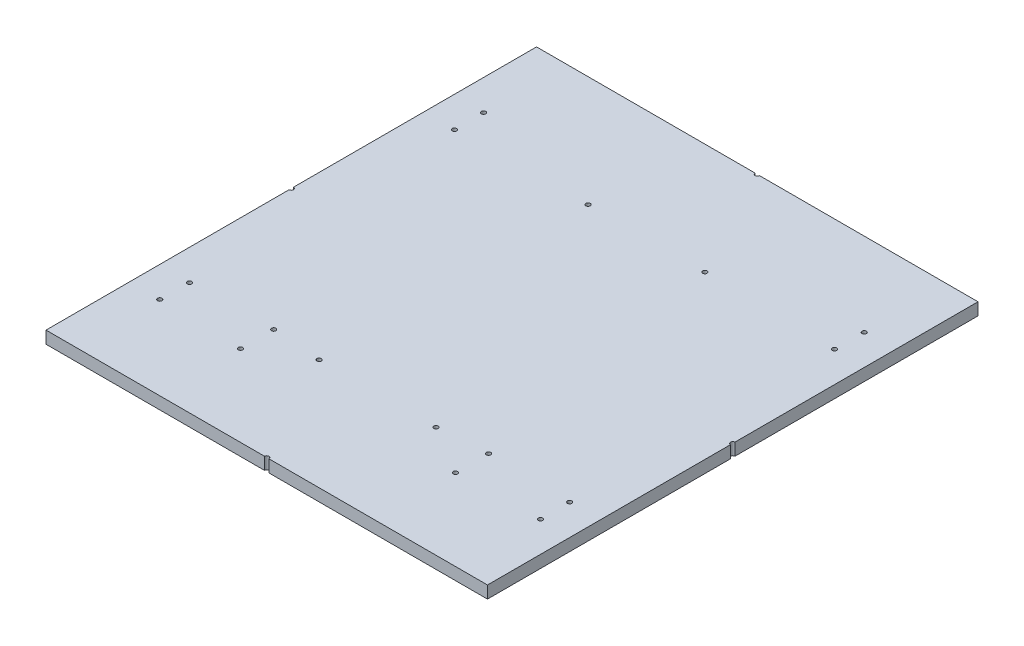
ISO-10303-21;
HEADER;
FILE_DESCRIPTION(('STEP AP214'),'2;1');
FILE_NAME('part.step','',(''),(''),'','','');
FILE_SCHEMA(('AUTOMOTIVE_DESIGN { 1 0 10303 214 1 1 1 1 }'));
ENDSEC;
DATA;
#1=APPLICATION_CONTEXT('core data for automotive mechanical design processes');
#2=APPLICATION_PROTOCOL_DEFINITION('international standard','automotive_design',2000,#1);
#3=PRODUCT_CONTEXT('',#1,'mechanical');
#4=PRODUCT('Part','Part','',(#3));
#5=PRODUCT_RELATED_PRODUCT_CATEGORY('part','',(#4));
#6=PRODUCT_DEFINITION_FORMATION('','',#4);
#7=PRODUCT_DEFINITION_CONTEXT('part definition',#1,'design');
#8=PRODUCT_DEFINITION('design','',#6,#7);
#9=PRODUCT_DEFINITION_SHAPE('','',#8);
#10=(LENGTH_UNIT() NAMED_UNIT(*) SI_UNIT(.MILLI.,.METRE.));
#11=(NAMED_UNIT(*) PLANE_ANGLE_UNIT() SI_UNIT($,.RADIAN.));
#12=(NAMED_UNIT(*) SI_UNIT($,.STERADIAN.) SOLID_ANGLE_UNIT());
#13=UNCERTAINTY_MEASURE_WITH_UNIT(LENGTH_MEASURE(1.E-05),#10,'distance_accuracy_value','');
#14=(GEOMETRIC_REPRESENTATION_CONTEXT(3) GLOBAL_UNCERTAINTY_ASSIGNED_CONTEXT((#13)) GLOBAL_UNIT_ASSIGNED_CONTEXT((#10,
#11,#12)) REPRESENTATION_CONTEXT('',''));
#15=CARTESIAN_POINT('',(0.,0.,0.));
#16=DIRECTION('',(0.,0.,1.));
#17=DIRECTION('',(1.,0.,0.));
#18=AXIS2_PLACEMENT_3D('',#15,#16,#17);
#19=CARTESIAN_POINT('',(0.,6.35,0.));
#20=DIRECTION('',(1.,0.,0.));
#21=DIRECTION('',(0.,0.,-1.));
#22=AXIS2_PLACEMENT_3D('',#19,#20,#21);
#23=PLANE('',#22);
#24=DIRECTION('',(0.,0.,1.));
#25=VECTOR('',#24,1.);
#26=CARTESIAN_POINT('',(0.,0.,0.));
#27=LINE('',#26,#25);
#28=CARTESIAN_POINT('',(0.,0.,-254.));
#29=VERTEX_POINT('',#28);
#30=CARTESIAN_POINT('',(0.,0.,-128.1303));
#31=VERTEX_POINT('',#30);
#32=EDGE_CURVE('E165',#29,#31,#27,.T.);
#33=ORIENTED_EDGE('',*,*,#32,.T.);
#34=DIRECTION('',(0.,1.,0.));
#35=VECTOR('',#34,1.);
#36=CARTESIAN_POINT('',(0.,6.35,-128.1303));
#37=LINE('',#36,#35);
#38=CARTESIAN_POINT('',(0.,6.35,-128.1303));
#39=VERTEX_POINT('',#38);
#40=EDGE_CURVE('E141',#31,#39,#37,.T.);
#41=ORIENTED_EDGE('',*,*,#40,.T.);
#42=DIRECTION('',(0.,0.,1.));
#43=VECTOR('',#42,1.);
#44=CARTESIAN_POINT('',(0.,6.35,0.));
#45=LINE('',#44,#43);
#46=CARTESIAN_POINT('',(0.,6.35,-254.));
#47=VERTEX_POINT('',#46);
#48=EDGE_CURVE('E220',#47,#39,#45,.T.);
#49=ORIENTED_EDGE('',*,*,#48,.F.);
#50=DIRECTION('',(0.,-1.,0.));
#51=VECTOR('',#50,1.);
#52=CARTESIAN_POINT('',(0.,6.35,-254.));
#53=LINE('',#52,#51);
#54=EDGE_CURVE('E185',#47,#29,#53,.T.);
#55=ORIENTED_EDGE('',*,*,#54,.T.);
#56=EDGE_LOOP('',(#33,#41,#49,#55));
#57=FACE_BOUND('',#56,.T.);
#58=ADVANCED_FACE('F52',(#57),#23,.F.);
#59=CARTESIAN_POINT('',(0.,0.,0.));
#60=DIRECTION('',(0.,-1.,0.));
#61=DIRECTION('',(0.,0.,-1.));
#62=AXIS2_PLACEMENT_3D('',#59,#60,#61);
#63=PLANE('',#62);
#64=CARTESIAN_POINT('',(58.6588414103042,0.,-59.1894930297));
#65=DIRECTION('',(0.,1.,0.));
#66=DIRECTION('',(0.,0.,1.));
#67=AXIS2_PLACEMENT_3D('',#64,#65,#66);
#68=CIRCLE('',#67,1.1303);
#69=CARTESIAN_POINT('',(58.6588414103042,0.,-58.0591930297));
#70=VERTEX_POINT('',#69);
#71=EDGE_CURVE('E728',#70,#70,#68,.T.);
#72=ORIENTED_EDGE('',*,*,#71,.T.);
#73=EDGE_LOOP('',(#72));
#74=FACE_BOUND('',#73,.T.);
#75=CARTESIAN_POINT('',(58.6588414103042,0.,-42.0497));
#76=DIRECTION('',(0.,1.,0.));
#77=DIRECTION('',(0.,0.,1.));
#78=AXIS2_PLACEMENT_3D('',#75,#76,#77);
#79=CIRCLE('',#78,1.1303);
#80=CARTESIAN_POINT('',(58.6588414103042,0.,-40.9194));
#81=VERTEX_POINT('',#80);
#82=EDGE_CURVE('E739',#81,#81,#79,.T.);
#83=ORIENTED_EDGE('',*,*,#82,.T.);
#84=EDGE_LOOP('',(#83));
#85=FACE_BOUND('',#84,.T.);
#86=CARTESIAN_POINT('',(169.961688198213,0.,-59.1894930297));
#87=DIRECTION('',(0.,1.,0.));
#88=DIRECTION('',(0.,0.,1.));
#89=AXIS2_PLACEMENT_3D('',#86,#87,#88);
#90=CIRCLE('',#89,1.1303);
#91=CARTESIAN_POINT('',(169.961688198213,0.,-58.0591930297));
#92=VERTEX_POINT('',#91);
#93=EDGE_CURVE('E742',#92,#92,#90,.T.);
#94=ORIENTED_EDGE('',*,*,#93,.T.);
#95=EDGE_LOOP('',(#94));
#96=FACE_BOUND('',#95,.T.);
#97=CARTESIAN_POINT('',(169.961688198213,0.,-42.0497));
#98=DIRECTION('',(0.,1.,0.));
#99=DIRECTION('',(0.,0.,1.));
#100=AXIS2_PLACEMENT_3D('',#97,#98,#99);
#101=CIRCLE('',#100,1.1303);
#102=CARTESIAN_POINT('',(169.961688198213,0.,-40.9194));
#103=VERTEX_POINT('',#102);
#104=EDGE_CURVE('E749',#103,#103,#101,.T.);
#105=ORIENTED_EDGE('',*,*,#104,.T.);
#106=EDGE_LOOP('',(#105));
#107=FACE_BOUND('',#106,.T.);
#108=CARTESIAN_POINT('',(15.7351594072584,0.,-43.18));
#109=DIRECTION('',(0.,1.,0.));
#110=DIRECTION('',(0.,0.,1.));
#111=AXIS2_PLACEMENT_3D('',#108,#109,#110);
#112=CIRCLE('',#111,1.1303);
#113=CARTESIAN_POINT('',(15.7351594072584,0.,-42.0497));
#114=VERTEX_POINT('',#113);
#115=EDGE_CURVE('E756',#114,#114,#112,.T.);
#116=ORIENTED_EDGE('',*,*,#115,.T.);
#117=EDGE_LOOP('',(#116));
#118=FACE_BOUND('',#117,.T.);
#119=CARTESIAN_POINT('',(15.8749999999998,0.,-58.42));
#120=DIRECTION('',(0.,1.,0.));
#121=DIRECTION('',(0.,0.,1.));
#122=AXIS2_PLACEMENT_3D('',#119,#120,#121);
#123=CIRCLE('',#122,1.1303);
#124=CARTESIAN_POINT('',(15.8749999999998,0.,-57.2897));
#125=VERTEX_POINT('',#124);
#126=EDGE_CURVE('E765',#125,#125,#123,.T.);
#127=ORIENTED_EDGE('',*,*,#126,.T.);
#128=EDGE_LOOP('',(#127));
#129=FACE_BOUND('',#128,.T.);
#130=CARTESIAN_POINT('',(84.0588414103042,0.,-57.3884371810008));
#131=DIRECTION('',(0.,1.,0.));
#132=DIRECTION('',(0.,0.,1.));
#133=AXIS2_PLACEMENT_3D('',#130,#131,#132);
#134=CIRCLE('',#133,1.1303);
#135=CARTESIAN_POINT('',(84.0588414103042,0.,-56.2581371810008));
#136=VERTEX_POINT('',#135);
#137=EDGE_CURVE('E767',#136,#136,#134,.T.);
#138=ORIENTED_EDGE('',*,*,#137,.T.);
#139=EDGE_LOOP('',(#138));
#140=FACE_BOUND('',#139,.T.);
#141=CARTESIAN_POINT('',(144.561688198213,0.,-57.3884371810008));
#142=DIRECTION('',(0.,1.,0.));
#143=DIRECTION('',(0.,0.,1.));
#144=AXIS2_PLACEMENT_3D('',#141,#142,#143);
#145=CIRCLE('',#144,1.1303);
#146=CARTESIAN_POINT('',(144.561688198213,0.,-56.2581371810008));
#147=VERTEX_POINT('',#146);
#148=EDGE_CURVE('E252',#147,#147,#145,.T.);
#149=ORIENTED_EDGE('',*,*,#148,.T.);
#150=EDGE_LOOP('',(#149));
#151=FACE_BOUND('',#150,.T.);
#152=CARTESIAN_POINT('',(0.,0.,-127.));
#153=DIRECTION('',(0.,1.,0.));
#154=DIRECTION('',(0.,0.,1.));
#155=AXIS2_PLACEMENT_3D('',#152,#153,#154);
#156=CIRCLE('',#155,1.1303);
#157=CARTESIAN_POINT('',(0.,0.,-125.8697));
#158=VERTEX_POINT('',#157);
#159=EDGE_CURVE('E139',#158,#31,#156,.T.);
#160=ORIENTED_EDGE('',*,*,#159,.T.);
#161=ORIENTED_EDGE('',*,*,#32,.F.);
#162=DIRECTION('',(-1.,0.,0.));
#163=VECTOR('',#162,1.);
#164=CARTESIAN_POINT('',(0.,0.,-254.));
#165=LINE('',#164,#163);
#166=CARTESIAN_POINT('',(113.1697,0.,-254.));
#167=VERTEX_POINT('',#166);
#168=EDGE_CURVE('E178',#167,#29,#165,.T.);
#169=ORIENTED_EDGE('',*,*,#168,.F.);
#170=CARTESIAN_POINT('',(114.3,0.,-254.));
#171=DIRECTION('',(0.,-1.,0.));
#172=DIRECTION('',(0.,0.,-1.));
#173=AXIS2_PLACEMENT_3D('',#170,#171,#172);
#174=CIRCLE('',#173,1.13029999999999);
#175=CARTESIAN_POINT('',(115.4303,0.,-254.));
#176=VERTEX_POINT('',#175);
#177=EDGE_CURVE('E193',#176,#167,#174,.T.);
#178=ORIENTED_EDGE('',*,*,#177,.F.);
#179=CARTESIAN_POINT('',(228.6,0.,-254.));
#180=VERTEX_POINT('',#179);
#181=EDGE_CURVE('E177',#180,#176,#165,.T.);
#182=ORIENTED_EDGE('',*,*,#181,.F.);
#183=DIRECTION('',(0.,0.,-1.));
#184=VECTOR('',#183,1.);
#185=CARTESIAN_POINT('',(228.6,0.,0.));
#186=LINE('',#185,#184);
#187=CARTESIAN_POINT('',(228.6,0.,-128.1303));
#188=VERTEX_POINT('',#187);
#189=EDGE_CURVE('E173',#188,#180,#186,.T.);
#190=ORIENTED_EDGE('',*,*,#189,.F.);
#191=CARTESIAN_POINT('',(228.6,0.,-127.));
#192=DIRECTION('',(0.,1.,0.));
#193=DIRECTION('',(0.,0.,1.));
#194=AXIS2_PLACEMENT_3D('',#191,#192,#193);
#195=CIRCLE('',#194,1.1303);
#196=CARTESIAN_POINT('',(228.6,0.,-125.8697));
#197=VERTEX_POINT('',#196);
#198=EDGE_CURVE('E194',#188,#197,#195,.T.);
#199=ORIENTED_EDGE('',*,*,#198,.T.);
#200=CARTESIAN_POINT('',(228.6,0.,0.));
#201=VERTEX_POINT('',#200);
#202=EDGE_CURVE('E175',#201,#197,#186,.T.);
#203=ORIENTED_EDGE('',*,*,#202,.F.);
#204=DIRECTION('',(1.,0.,0.));
#205=VECTOR('',#204,1.);
#206=CARTESIAN_POINT('',(0.,0.,0.));
#207=LINE('',#206,#205);
#208=CARTESIAN_POINT('',(115.4303,0.,0.));
#209=VERTEX_POINT('',#208);
#210=EDGE_CURVE('E164',#209,#201,#207,.T.);
#211=ORIENTED_EDGE('',*,*,#210,.F.);
#212=CARTESIAN_POINT('',(114.3,0.,0.));
#213=DIRECTION('',(0.,1.,0.));
#214=DIRECTION('',(0.,0.,1.));
#215=AXIS2_PLACEMENT_3D('',#212,#213,#214);
#216=CIRCLE('',#215,1.1303);
#217=CARTESIAN_POINT('',(113.1697,0.,0.));
#218=VERTEX_POINT('',#217);
#219=EDGE_CURVE('E76',#209,#218,#216,.T.);
#220=ORIENTED_EDGE('',*,*,#219,.T.);
#221=CARTESIAN_POINT('',(0.,0.,0.));
#222=VERTEX_POINT('',#221);
#223=EDGE_CURVE('E159',#222,#218,#207,.T.);
#224=ORIENTED_EDGE('',*,*,#223,.F.);
#225=EDGE_CURVE('E153',#158,#222,#27,.T.);
#226=ORIENTED_EDGE('',*,*,#225,.F.);
#227=EDGE_LOOP('',(#160,#161,#169,#178,#182,#190,#199,#203,#211,#220,#224,#226));
#228=FACE_BOUND('',#227,.T.);
#229=CARTESIAN_POINT('',(144.561688198213,0.,-196.611562818999));
#230=DIRECTION('',(0.,1.,0.));
#231=DIRECTION('',(0.,0.,1.));
#232=AXIS2_PLACEMENT_3D('',#229,#230,#231);
#233=CIRCLE('',#232,1.1303);
#234=CARTESIAN_POINT('',(144.561688198213,0.,-195.481262818999));
#235=VERTEX_POINT('',#234);
#236=EDGE_CURVE('E263',#235,#235,#233,.T.);
#237=ORIENTED_EDGE('',*,*,#236,.T.);
#238=EDGE_LOOP('',(#237));
#239=FACE_BOUND('',#238,.T.);
#240=CARTESIAN_POINT('',(84.0588414103042,0.,-196.611562818999));
#241=DIRECTION('',(0.,1.,0.));
#242=DIRECTION('',(0.,0.,1.));
#243=AXIS2_PLACEMENT_3D('',#240,#241,#242);
#244=CIRCLE('',#243,1.1303);
#245=CARTESIAN_POINT('',(84.0588414103042,0.,-195.481262818999));
#246=VERTEX_POINT('',#245);
#247=EDGE_CURVE('E267',#246,#246,#244,.T.);
#248=ORIENTED_EDGE('',*,*,#247,.T.);
#249=EDGE_LOOP('',(#248));
#250=FACE_BOUND('',#249,.T.);
#251=CARTESIAN_POINT('',(15.8749999999998,0.,-195.58));
#252=DIRECTION('',(0.,1.,0.));
#253=DIRECTION('',(0.,0.,1.));
#254=AXIS2_PLACEMENT_3D('',#251,#252,#253);
#255=CIRCLE('',#254,1.1303);
#256=CARTESIAN_POINT('',(15.8749999999998,0.,-194.4497));
#257=VERTEX_POINT('',#256);
#258=EDGE_CURVE('E274',#257,#257,#255,.T.);
#259=ORIENTED_EDGE('',*,*,#258,.T.);
#260=EDGE_LOOP('',(#259));
#261=FACE_BOUND('',#260,.T.);
#262=CARTESIAN_POINT('',(15.7351594072584,0.,-210.82));
#263=DIRECTION('',(0.,1.,0.));
#264=DIRECTION('',(0.,0.,1.));
#265=AXIS2_PLACEMENT_3D('',#262,#263,#264);
#266=CIRCLE('',#265,1.1303);
#267=CARTESIAN_POINT('',(15.7351594072584,0.,-209.6897));
#268=VERTEX_POINT('',#267);
#269=EDGE_CURVE('E281',#268,#268,#266,.T.);
#270=ORIENTED_EDGE('',*,*,#269,.T.);
#271=EDGE_LOOP('',(#270));
#272=FACE_BOUND('',#271,.T.);
#273=CARTESIAN_POINT('',(212.864840592742,0.,-43.18));
#274=DIRECTION('',(0.,1.,0.));
#275=DIRECTION('',(0.,0.,1.));
#276=AXIS2_PLACEMENT_3D('',#273,#274,#275);
#277=CIRCLE('',#276,1.1303);
#278=CARTESIAN_POINT('',(212.864840592742,0.,-42.0497));
#279=VERTEX_POINT('',#278);
#280=EDGE_CURVE('E289',#279,#279,#277,.T.);
#281=ORIENTED_EDGE('',*,*,#280,.T.);
#282=EDGE_LOOP('',(#281));
#283=FACE_BOUND('',#282,.T.);
#284=CARTESIAN_POINT('',(212.725,0.,-58.42));
#285=DIRECTION('',(0.,1.,0.));
#286=DIRECTION('',(0.,0.,1.));
#287=AXIS2_PLACEMENT_3D('',#284,#285,#286);
#288=CIRCLE('',#287,1.1303);
#289=CARTESIAN_POINT('',(212.725,0.,-57.2897));
#290=VERTEX_POINT('',#289);
#291=EDGE_CURVE('E296',#290,#290,#288,.T.);
#292=ORIENTED_EDGE('',*,*,#291,.T.);
#293=EDGE_LOOP('',(#292));
#294=FACE_BOUND('',#293,.T.);
#295=CARTESIAN_POINT('',(212.864840592742,0.,-210.82));
#296=DIRECTION('',(0.,1.,0.));
#297=DIRECTION('',(0.,0.,1.));
#298=AXIS2_PLACEMENT_3D('',#295,#296,#297);
#299=CIRCLE('',#298,1.1303);
#300=CARTESIAN_POINT('',(212.864840592742,0.,-209.6897));
#301=VERTEX_POINT('',#300);
#302=EDGE_CURVE('E305',#301,#301,#299,.T.);
#303=ORIENTED_EDGE('',*,*,#302,.T.);
#304=EDGE_LOOP('',(#303));
#305=FACE_BOUND('',#304,.T.);
#306=CARTESIAN_POINT('',(212.725,0.,-195.58));
#307=DIRECTION('',(0.,1.,0.));
#308=DIRECTION('',(0.,0.,1.));
#309=AXIS2_PLACEMENT_3D('',#306,#307,#308);
#310=CIRCLE('',#309,1.1303);
#311=CARTESIAN_POINT('',(212.725,0.,-194.4497));
#312=VERTEX_POINT('',#311);
#313=EDGE_CURVE('E209',#312,#312,#310,.T.);
#314=ORIENTED_EDGE('',*,*,#313,.T.);
#315=EDGE_LOOP('',(#314));
#316=FACE_BOUND('',#315,.T.);
#317=ADVANCED_FACE('F160',(#74,#85,#96,#107,#118,#129,#140,#151,#228,#239,#250,#261,#272,#283,
#294,#305,#316),#63,.T.);
#318=CARTESIAN_POINT('',(0.,6.35,0.));
#319=DIRECTION('',(0.,-1.,0.));
#320=DIRECTION('',(0.,0.,-1.));
#321=AXIS2_PLACEMENT_3D('',#318,#319,#320);
#322=PLANE('',#321);
#323=CARTESIAN_POINT('',(58.6588414103042,6.35,-59.1894930297));
#324=DIRECTION('',(0.,1.,0.));
#325=DIRECTION('',(0.,0.,1.));
#326=AXIS2_PLACEMENT_3D('',#323,#324,#325);
#327=CIRCLE('',#326,1.1303);
#328=CARTESIAN_POINT('',(58.6588414103042,6.35,-58.0591930297));
#329=VERTEX_POINT('',#328);
#330=EDGE_CURVE('E732',#329,#329,#327,.T.);
#331=ORIENTED_EDGE('',*,*,#330,.F.);
#332=EDGE_LOOP('',(#331));
#333=FACE_BOUND('',#332,.T.);
#334=CARTESIAN_POINT('',(58.6588414103042,6.35,-42.0497));
#335=DIRECTION('',(0.,1.,0.));
#336=DIRECTION('',(0.,0.,1.));
#337=AXIS2_PLACEMENT_3D('',#334,#335,#336);
#338=CIRCLE('',#337,1.1303);
#339=CARTESIAN_POINT('',(58.6588414103042,6.35,-40.9194));
#340=VERTEX_POINT('',#339);
#341=EDGE_CURVE('E731',#340,#340,#338,.T.);
#342=ORIENTED_EDGE('',*,*,#341,.F.);
#343=EDGE_LOOP('',(#342));
#344=FACE_BOUND('',#343,.T.);
#345=CARTESIAN_POINT('',(169.961688198213,6.35,-59.1894930297));
#346=DIRECTION('',(0.,1.,0.));
#347=DIRECTION('',(0.,0.,1.));
#348=AXIS2_PLACEMENT_3D('',#345,#346,#347);
#349=CIRCLE('',#348,1.1303);
#350=CARTESIAN_POINT('',(169.961688198213,6.35,-58.0591930297));
#351=VERTEX_POINT('',#350);
#352=EDGE_CURVE('E741',#351,#351,#349,.T.);
#353=ORIENTED_EDGE('',*,*,#352,.F.);
#354=EDGE_LOOP('',(#353));
#355=FACE_BOUND('',#354,.T.);
#356=CARTESIAN_POINT('',(169.961688198213,6.35,-42.0497));
#357=DIRECTION('',(0.,1.,0.));
#358=DIRECTION('',(0.,0.,1.));
#359=AXIS2_PLACEMENT_3D('',#356,#357,#358);
#360=CIRCLE('',#359,1.1303);
#361=CARTESIAN_POINT('',(169.961688198213,6.35,-40.9194));
#362=VERTEX_POINT('',#361);
#363=EDGE_CURVE('E747',#362,#362,#360,.T.);
#364=ORIENTED_EDGE('',*,*,#363,.F.);
#365=EDGE_LOOP('',(#364));
#366=FACE_BOUND('',#365,.T.);
#367=CARTESIAN_POINT('',(15.7351594072584,6.35,-43.18));
#368=DIRECTION('',(0.,1.,0.));
#369=DIRECTION('',(0.,0.,1.));
#370=AXIS2_PLACEMENT_3D('',#367,#368,#369);
#371=CIRCLE('',#370,1.13029999999999);
#372=CARTESIAN_POINT('',(15.7351594072584,6.35,-42.0497));
#373=VERTEX_POINT('',#372);
#374=EDGE_CURVE('E751',#373,#373,#371,.T.);
#375=ORIENTED_EDGE('',*,*,#374,.F.);
#376=EDGE_LOOP('',(#375));
#377=FACE_BOUND('',#376,.T.);
#378=CARTESIAN_POINT('',(15.8749999999998,6.35,-58.42));
#379=DIRECTION('',(0.,1.,0.));
#380=DIRECTION('',(0.,0.,1.));
#381=AXIS2_PLACEMENT_3D('',#378,#379,#380);
#382=CIRCLE('',#381,1.13029999999999);
#383=CARTESIAN_POINT('',(15.8749999999998,6.35,-57.2897));
#384=VERTEX_POINT('',#383);
#385=EDGE_CURVE('E757',#384,#384,#382,.T.);
#386=ORIENTED_EDGE('',*,*,#385,.F.);
#387=EDGE_LOOP('',(#386));
#388=FACE_BOUND('',#387,.T.);
#389=CARTESIAN_POINT('',(84.0588414103042,6.35,-57.3884371810008));
#390=DIRECTION('',(0.,1.,0.));
#391=DIRECTION('',(0.,0.,1.));
#392=AXIS2_PLACEMENT_3D('',#389,#390,#391);
#393=CIRCLE('',#392,1.13029999999999);
#394=CARTESIAN_POINT('',(84.0588414103042,6.35,-56.2581371810008));
#395=VERTEX_POINT('',#394);
#396=EDGE_CURVE('E764',#395,#395,#393,.T.);
#397=ORIENTED_EDGE('',*,*,#396,.F.);
#398=EDGE_LOOP('',(#397));
#399=FACE_BOUND('',#398,.T.);
#400=CARTESIAN_POINT('',(144.561688198213,6.35,-57.3884371810008));
#401=DIRECTION('',(0.,1.,0.));
#402=DIRECTION('',(0.,0.,1.));
#403=AXIS2_PLACEMENT_3D('',#400,#401,#402);
#404=CIRCLE('',#403,1.1303);
#405=CARTESIAN_POINT('',(144.561688198213,6.35,-56.2581371810008));
#406=VERTEX_POINT('',#405);
#407=EDGE_CURVE('E254',#406,#406,#404,.T.);
#408=ORIENTED_EDGE('',*,*,#407,.F.);
#409=EDGE_LOOP('',(#408));
#410=FACE_BOUND('',#409,.T.);
#411=CARTESIAN_POINT('',(144.561688198213,6.35,-196.611562818999));
#412=DIRECTION('',(0.,1.,0.));
#413=DIRECTION('',(0.,0.,1.));
#414=AXIS2_PLACEMENT_3D('',#411,#412,#413);
#415=CIRCLE('',#414,1.1303);
#416=CARTESIAN_POINT('',(144.561688198213,6.35,-195.481262818999));
#417=VERTEX_POINT('',#416);
#418=EDGE_CURVE('E257',#417,#417,#415,.T.);
#419=ORIENTED_EDGE('',*,*,#418,.F.);
#420=EDGE_LOOP('',(#419));
#421=FACE_BOUND('',#420,.T.);
#422=CARTESIAN_POINT('',(84.0588414103042,6.35,-196.611562818999));
#423=DIRECTION('',(0.,1.,0.));
#424=DIRECTION('',(0.,0.,1.));
#425=AXIS2_PLACEMENT_3D('',#422,#423,#424);
#426=CIRCLE('',#425,1.13029999999999);
#427=CARTESIAN_POINT('',(84.0588414103042,6.35,-195.481262818999));
#428=VERTEX_POINT('',#427);
#429=EDGE_CURVE('E266',#428,#428,#426,.T.);
#430=ORIENTED_EDGE('',*,*,#429,.F.);
#431=EDGE_LOOP('',(#430));
#432=FACE_BOUND('',#431,.T.);
#433=CARTESIAN_POINT('',(15.8749999999998,6.35,-195.58));
#434=DIRECTION('',(0.,1.,0.));
#435=DIRECTION('',(0.,0.,1.));
#436=AXIS2_PLACEMENT_3D('',#433,#434,#435);
#437=CIRCLE('',#436,1.13029999999999);
#438=CARTESIAN_POINT('',(15.8749999999998,6.35,-194.4497));
#439=VERTEX_POINT('',#438);
#440=EDGE_CURVE('E275',#439,#439,#437,.T.);
#441=ORIENTED_EDGE('',*,*,#440,.F.);
#442=EDGE_LOOP('',(#441));
#443=FACE_BOUND('',#442,.T.);
#444=CARTESIAN_POINT('',(15.7351594072584,6.35,-210.82));
#445=DIRECTION('',(0.,1.,0.));
#446=DIRECTION('',(0.,0.,1.));
#447=AXIS2_PLACEMENT_3D('',#444,#445,#446);
#448=CIRCLE('',#447,1.13029999999999);
#449=CARTESIAN_POINT('',(15.7351594072584,6.35,-209.6897));
#450=VERTEX_POINT('',#449);
#451=EDGE_CURVE('E279',#450,#450,#448,.T.);
#452=ORIENTED_EDGE('',*,*,#451,.F.);
#453=EDGE_LOOP('',(#452));
#454=FACE_BOUND('',#453,.T.);
#455=CARTESIAN_POINT('',(212.725,6.35,-195.58));
#456=DIRECTION('',(0.,1.,0.));
#457=DIRECTION('',(0.,0.,1.));
#458=AXIS2_PLACEMENT_3D('',#455,#456,#457);
#459=CIRCLE('',#458,1.13029999999997);
#460=CARTESIAN_POINT('',(212.725,6.35,-194.4497));
#461=VERTEX_POINT('',#460);
#462=EDGE_CURVE('E304',#461,#461,#459,.T.);
#463=ORIENTED_EDGE('',*,*,#462,.F.);
#464=EDGE_LOOP('',(#463));
#465=FACE_BOUND('',#464,.T.);
#466=CARTESIAN_POINT('',(212.864840592742,6.35,-210.82));
#467=DIRECTION('',(0.,1.,0.));
#468=DIRECTION('',(0.,0.,1.));
#469=AXIS2_PLACEMENT_3D('',#466,#467,#468);
#470=CIRCLE('',#469,1.13029999999997);
#471=CARTESIAN_POINT('',(212.864840592742,6.35,-209.6897));
#472=VERTEX_POINT('',#471);
#473=EDGE_CURVE('E298',#472,#472,#470,.T.);
#474=ORIENTED_EDGE('',*,*,#473,.F.);
#475=EDGE_LOOP('',(#474));
#476=FACE_BOUND('',#475,.T.);
#477=CARTESIAN_POINT('',(212.725,6.35,-58.42));
#478=DIRECTION('',(0.,1.,0.));
#479=DIRECTION('',(0.,0.,1.));
#480=AXIS2_PLACEMENT_3D('',#477,#478,#479);
#481=CIRCLE('',#480,1.13029999999997);
#482=CARTESIAN_POINT('',(212.725,6.35,-57.2897));
#483=VERTEX_POINT('',#482);
#484=EDGE_CURVE('E291',#483,#483,#481,.T.);
#485=ORIENTED_EDGE('',*,*,#484,.F.);
#486=EDGE_LOOP('',(#485));
#487=FACE_BOUND('',#486,.T.);
#488=CARTESIAN_POINT('',(212.864840592742,6.35,-43.18));
#489=DIRECTION('',(0.,1.,0.));
#490=DIRECTION('',(0.,0.,1.));
#491=AXIS2_PLACEMENT_3D('',#488,#489,#490);
#492=CIRCLE('',#491,1.13029999999997);
#493=CARTESIAN_POINT('',(212.864840592742,6.35,-42.0497));
#494=VERTEX_POINT('',#493);
#495=EDGE_CURVE('E290',#494,#494,#492,.T.);
#496=ORIENTED_EDGE('',*,*,#495,.F.);
#497=EDGE_LOOP('',(#496));
#498=FACE_BOUND('',#497,.T.);
#499=ORIENTED_EDGE('',*,*,#48,.T.);
#500=CARTESIAN_POINT('',(0.,6.35,-127.));
#501=DIRECTION('',(0.,1.,0.));
#502=DIRECTION('',(0.,0.,1.));
#503=AXIS2_PLACEMENT_3D('',#500,#501,#502);
#504=CIRCLE('',#503,1.13029999999999);
#505=CARTESIAN_POINT('',(0.,6.35,-125.8697));
#506=VERTEX_POINT('',#505);
#507=EDGE_CURVE('E146',#506,#39,#504,.T.);
#508=ORIENTED_EDGE('',*,*,#507,.F.);
#509=CARTESIAN_POINT('',(0.,6.35,0.));
#510=VERTEX_POINT('',#509);
#511=EDGE_CURVE('E154',#506,#510,#45,.T.);
#512=ORIENTED_EDGE('',*,*,#511,.T.);
#513=DIRECTION('',(1.,0.,0.));
#514=VECTOR('',#513,1.);
#515=CARTESIAN_POINT('',(0.,6.35,0.));
#516=LINE('',#515,#514);
#517=CARTESIAN_POINT('',(113.1697,6.35,0.));
#518=VERTEX_POINT('',#517);
#519=EDGE_CURVE('E222',#510,#518,#516,.T.);
#520=ORIENTED_EDGE('',*,*,#519,.T.);
#521=CARTESIAN_POINT('',(114.3,6.35,0.));
#522=DIRECTION('',(0.,1.,0.));
#523=DIRECTION('',(0.,0.,1.));
#524=AXIS2_PLACEMENT_3D('',#521,#522,#523);
#525=CIRCLE('',#524,1.13029999999999);
#526=CARTESIAN_POINT('',(115.4303,6.35,0.));
#527=VERTEX_POINT('',#526);
#528=EDGE_CURVE('E283',#527,#518,#525,.T.);
#529=ORIENTED_EDGE('',*,*,#528,.F.);
#530=CARTESIAN_POINT('',(228.6,6.35,0.));
#531=VERTEX_POINT('',#530);
#532=EDGE_CURVE('E219',#527,#531,#516,.T.);
#533=ORIENTED_EDGE('',*,*,#532,.T.);
#534=DIRECTION('',(0.,0.,-1.));
#535=VECTOR('',#534,1.);
#536=CARTESIAN_POINT('',(228.6,6.35,0.));
#537=LINE('',#536,#535);
#538=CARTESIAN_POINT('',(228.6,6.35,-125.8697));
#539=VERTEX_POINT('',#538);
#540=EDGE_CURVE('E221',#531,#539,#537,.T.);
#541=ORIENTED_EDGE('',*,*,#540,.T.);
#542=CARTESIAN_POINT('',(228.6,6.35,-127.));
#543=DIRECTION('',(0.,1.,0.));
#544=DIRECTION('',(0.,0.,1.));
#545=AXIS2_PLACEMENT_3D('',#542,#543,#544);
#546=CIRCLE('',#545,1.13029999999997);
#547=CARTESIAN_POINT('',(228.6,6.35,-128.1303));
#548=VERTEX_POINT('',#547);
#549=EDGE_CURVE('E192',#548,#539,#546,.T.);
#550=ORIENTED_EDGE('',*,*,#549,.F.);
#551=CARTESIAN_POINT('',(228.6,6.35,-254.));
#552=VERTEX_POINT('',#551);
#553=EDGE_CURVE('E224',#548,#552,#537,.T.);
#554=ORIENTED_EDGE('',*,*,#553,.T.);
#555=DIRECTION('',(-1.,0.,0.));
#556=VECTOR('',#555,1.);
#557=CARTESIAN_POINT('',(0.,6.35,-254.));
#558=LINE('',#557,#556);
#559=CARTESIAN_POINT('',(115.4303,6.35,-254.));
#560=VERTEX_POINT('',#559);
#561=EDGE_CURVE('E171',#552,#560,#558,.T.);
#562=ORIENTED_EDGE('',*,*,#561,.T.);
#563=CARTESIAN_POINT('',(114.3,6.35,-254.));
#564=DIRECTION('',(0.,1.,0.));
#565=DIRECTION('',(0.,0.,1.));
#566=AXIS2_PLACEMENT_3D('',#563,#564,#565);
#567=CIRCLE('',#566,1.13029999999999);
#568=CARTESIAN_POINT('',(113.1697,6.35,-254.));
#569=VERTEX_POINT('',#568);
#570=EDGE_CURVE('E213',#569,#560,#567,.T.);
#571=ORIENTED_EDGE('',*,*,#570,.F.);
#572=EDGE_CURVE('E226',#569,#47,#558,.T.);
#573=ORIENTED_EDGE('',*,*,#572,.T.);
#574=EDGE_LOOP('',(#499,#508,#512,#520,#529,#533,#541,#550,#554,#562,#571,#573));
#575=FACE_BOUND('',#574,.T.);
#576=ADVANCED_FACE('F233',(#333,#344,#355,#366,#377,#388,#399,#410,#421,#432,#443,#454,#465,
#476,#487,#498,#575),#322,.F.);
#577=CARTESIAN_POINT('',(0.,6.35,0.));
#578=DIRECTION('',(0.,0.,-1.));
#579=DIRECTION('',(-1.,0.,0.));
#580=AXIS2_PLACEMENT_3D('',#577,#578,#579);
#581=PLANE('',#580);
#582=ORIENTED_EDGE('',*,*,#223,.T.);
#583=DIRECTION('',(0.,1.,0.));
#584=VECTOR('',#583,1.);
#585=CARTESIAN_POINT('',(113.1697,6.35,0.));
#586=LINE('',#585,#584);
#587=EDGE_CURVE('E11',#218,#518,#586,.T.);
#588=ORIENTED_EDGE('',*,*,#587,.T.);
#589=ORIENTED_EDGE('',*,*,#519,.F.);
#590=DIRECTION('',(0.,-1.,0.));
#591=VECTOR('',#590,1.);
#592=CARTESIAN_POINT('',(0.,6.35,0.));
#593=LINE('',#592,#591);
#594=EDGE_CURVE('E191',#510,#222,#593,.T.);
#595=ORIENTED_EDGE('',*,*,#594,.T.);
#596=EDGE_LOOP('',(#582,#588,#589,#595));
#597=FACE_BOUND('',#596,.T.);
#598=ADVANCED_FACE('F321',(#597),#581,.F.);
#599=CARTESIAN_POINT('',(228.6,6.35,0.));
#600=DIRECTION('',(-1.,0.,0.));
#601=DIRECTION('',(0.,0.,1.));
#602=AXIS2_PLACEMENT_3D('',#599,#600,#601);
#603=PLANE('',#602);
#604=ORIENTED_EDGE('',*,*,#202,.T.);
#605=DIRECTION('',(0.,1.,0.));
#606=VECTOR('',#605,1.);
#607=CARTESIAN_POINT('',(228.6,6.35,-125.8697));
#608=LINE('',#607,#606);
#609=EDGE_CURVE('E207',#197,#539,#608,.T.);
#610=ORIENTED_EDGE('',*,*,#609,.T.);
#611=ORIENTED_EDGE('',*,*,#540,.F.);
#612=DIRECTION('',(0.,-1.,0.));
#613=VECTOR('',#612,1.);
#614=CARTESIAN_POINT('',(228.6,6.35,0.));
#615=LINE('',#614,#613);
#616=EDGE_CURVE('E189',#531,#201,#615,.T.);
#617=ORIENTED_EDGE('',*,*,#616,.T.);
#618=EDGE_LOOP('',(#604,#610,#611,#617));
#619=FACE_BOUND('',#618,.T.);
#620=ADVANCED_FACE('F357',(#619),#603,.F.);
#621=CARTESIAN_POINT('',(0.,6.35,-254.));
#622=DIRECTION('',(0.,0.,1.));
#623=DIRECTION('',(1.,0.,0.));
#624=AXIS2_PLACEMENT_3D('',#621,#622,#623);
#625=PLANE('',#624);
#626=ORIENTED_EDGE('',*,*,#181,.T.);
#627=DIRECTION('',(0.,1.,0.));
#628=VECTOR('',#627,1.);
#629=CARTESIAN_POINT('',(115.4303,6.35,-254.));
#630=LINE('',#629,#628);
#631=EDGE_CURVE('E162',#176,#560,#630,.T.);
#632=ORIENTED_EDGE('',*,*,#631,.T.);
#633=ORIENTED_EDGE('',*,*,#561,.F.);
#634=DIRECTION('',(0.,-1.,0.));
#635=VECTOR('',#634,1.);
#636=CARTESIAN_POINT('',(228.6,6.35,-254.));
#637=LINE('',#636,#635);
#638=EDGE_CURVE('E183',#552,#180,#637,.T.);
#639=ORIENTED_EDGE('',*,*,#638,.T.);
#640=EDGE_LOOP('',(#626,#632,#633,#639));
#641=FACE_BOUND('',#640,.T.);
#642=ADVANCED_FACE('F238',(#641),#625,.F.);
#643=ORIENTED_EDGE('',*,*,#511,.F.);
#644=DIRECTION('',(0.,1.,0.));
#645=VECTOR('',#644,1.);
#646=CARTESIAN_POINT('',(0.,6.35,-125.8697));
#647=LINE('',#646,#645);
#648=EDGE_CURVE('E68',#506,#158,#647,.F.);
#649=ORIENTED_EDGE('',*,*,#648,.T.);
#650=ORIENTED_EDGE('',*,*,#225,.T.);
#651=ORIENTED_EDGE('',*,*,#594,.F.);
#652=EDGE_LOOP('',(#643,#649,#650,#651));
#653=FACE_BOUND('',#652,.T.);
#654=ADVANCED_FACE('F54',(#653),#23,.F.);
#655=ORIENTED_EDGE('',*,*,#532,.F.);
#656=DIRECTION('',(0.,1.,0.));
#657=VECTOR('',#656,1.);
#658=CARTESIAN_POINT('',(115.4303,6.35,0.));
#659=LINE('',#658,#657);
#660=EDGE_CURVE('E61',#527,#209,#659,.F.);
#661=ORIENTED_EDGE('',*,*,#660,.T.);
#662=ORIENTED_EDGE('',*,*,#210,.T.);
#663=ORIENTED_EDGE('',*,*,#616,.F.);
#664=EDGE_LOOP('',(#655,#661,#662,#663));
#665=FACE_BOUND('',#664,.T.);
#666=ADVANCED_FACE('F353',(#665),#581,.F.);
#667=ORIENTED_EDGE('',*,*,#553,.F.);
#668=DIRECTION('',(0.,1.,0.));
#669=VECTOR('',#668,1.);
#670=CARTESIAN_POINT('',(228.6,6.35,-128.1303));
#671=LINE('',#670,#669);
#672=EDGE_CURVE('E206',#548,#188,#671,.F.);
#673=ORIENTED_EDGE('',*,*,#672,.T.);
#674=ORIENTED_EDGE('',*,*,#189,.T.);
#675=ORIENTED_EDGE('',*,*,#638,.F.);
#676=EDGE_LOOP('',(#667,#673,#674,#675));
#677=FACE_BOUND('',#676,.T.);
#678=ADVANCED_FACE('F240',(#677),#603,.F.);
#679=ORIENTED_EDGE('',*,*,#572,.F.);
#680=DIRECTION('',(0.,1.,0.));
#681=VECTOR('',#680,1.);
#682=CARTESIAN_POINT('',(113.1697,6.35,-254.));
#683=LINE('',#682,#681);
#684=EDGE_CURVE('E170',#569,#167,#683,.F.);
#685=ORIENTED_EDGE('',*,*,#684,.T.);
#686=ORIENTED_EDGE('',*,*,#168,.T.);
#687=ORIENTED_EDGE('',*,*,#54,.F.);
#688=EDGE_LOOP('',(#679,#685,#686,#687));
#689=FACE_BOUND('',#688,.T.);
#690=ADVANCED_FACE('F248',(#689),#625,.F.);
#691=CARTESIAN_POINT('',(114.3,6.35,-254.));
#692=DIRECTION('',(0.,1.,0.));
#693=DIRECTION('',(0.,0.,1.));
#694=AXIS2_PLACEMENT_3D('',#691,#692,#693);
#695=CYLINDRICAL_SURFACE('',#694,1.13029999999999);
#696=ORIENTED_EDGE('',*,*,#177,.T.);
#697=ORIENTED_EDGE('',*,*,#684,.F.);
#698=ORIENTED_EDGE('',*,*,#570,.T.);
#699=ORIENTED_EDGE('',*,*,#631,.F.);
#700=EDGE_LOOP('',(#696,#697,#698,#699));
#701=FACE_BOUND('',#700,.T.);
#702=ADVANCED_FACE('F244',(#701),#695,.F.);
#703=CARTESIAN_POINT('',(228.6,6.35,-127.));
#704=DIRECTION('',(0.,1.,0.));
#705=DIRECTION('',(0.,0.,1.));
#706=AXIS2_PLACEMENT_3D('',#703,#704,#705);
#707=CYLINDRICAL_SURFACE('',#706,1.13029999999999);
#708=ORIENTED_EDGE('',*,*,#198,.F.);
#709=ORIENTED_EDGE('',*,*,#672,.F.);
#710=ORIENTED_EDGE('',*,*,#549,.T.);
#711=ORIENTED_EDGE('',*,*,#609,.F.);
#712=EDGE_LOOP('',(#708,#709,#710,#711));
#713=FACE_BOUND('',#712,.T.);
#714=ADVANCED_FACE('F312',(#713),#707,.F.);
#715=CARTESIAN_POINT('',(212.725,6.35,-195.58));
#716=DIRECTION('',(0.,1.,0.));
#717=DIRECTION('',(0.,0.,1.));
#718=AXIS2_PLACEMENT_3D('',#715,#716,#717);
#719=CYLINDRICAL_SURFACE('',#718,1.13029999999999);
#720=ORIENTED_EDGE('',*,*,#313,.F.);
#721=EDGE_LOOP('',(#720));
#722=FACE_BOUND('',#721,.T.);
#723=ORIENTED_EDGE('',*,*,#462,.T.);
#724=EDGE_LOOP('',(#723));
#725=FACE_BOUND('',#724,.T.);
#726=ADVANCED_FACE('F313',(#722,#725),#719,.F.);
#727=CARTESIAN_POINT('',(212.864840592742,6.35,-210.82));
#728=DIRECTION('',(0.,1.,0.));
#729=DIRECTION('',(0.,0.,1.));
#730=AXIS2_PLACEMENT_3D('',#727,#728,#729);
#731=CYLINDRICAL_SURFACE('',#730,1.13029999999999);
#732=ORIENTED_EDGE('',*,*,#302,.F.);
#733=EDGE_LOOP('',(#732));
#734=FACE_BOUND('',#733,.T.);
#735=ORIENTED_EDGE('',*,*,#473,.T.);
#736=EDGE_LOOP('',(#735));
#737=FACE_BOUND('',#736,.T.);
#738=ADVANCED_FACE('F314',(#734,#737),#731,.F.);
#739=CARTESIAN_POINT('',(212.725,6.35,-58.42));
#740=DIRECTION('',(0.,1.,0.));
#741=DIRECTION('',(0.,0.,1.));
#742=AXIS2_PLACEMENT_3D('',#739,#740,#741);
#743=CYLINDRICAL_SURFACE('',#742,1.13029999999999);
#744=ORIENTED_EDGE('',*,*,#291,.F.);
#745=EDGE_LOOP('',(#744));
#746=FACE_BOUND('',#745,.T.);
#747=ORIENTED_EDGE('',*,*,#484,.T.);
#748=EDGE_LOOP('',(#747));
#749=FACE_BOUND('',#748,.T.);
#750=ADVANCED_FACE('F334',(#746,#749),#743,.F.);
#751=CARTESIAN_POINT('',(212.864840592742,6.35,-43.18));
#752=DIRECTION('',(0.,1.,0.));
#753=DIRECTION('',(0.,0.,1.));
#754=AXIS2_PLACEMENT_3D('',#751,#752,#753);
#755=CYLINDRICAL_SURFACE('',#754,1.13029999999999);
#756=ORIENTED_EDGE('',*,*,#280,.F.);
#757=EDGE_LOOP('',(#756));
#758=FACE_BOUND('',#757,.T.);
#759=ORIENTED_EDGE('',*,*,#495,.T.);
#760=EDGE_LOOP('',(#759));
#761=FACE_BOUND('',#760,.T.);
#762=ADVANCED_FACE('F329',(#758,#761),#755,.F.);
#763=CARTESIAN_POINT('',(114.3,6.35,0.));
#764=DIRECTION('',(0.,1.,0.));
#765=DIRECTION('',(0.,0.,1.));
#766=AXIS2_PLACEMENT_3D('',#763,#764,#765);
#767=CYLINDRICAL_SURFACE('',#766,1.13029999999999);
#768=ORIENTED_EDGE('',*,*,#219,.F.);
#769=ORIENTED_EDGE('',*,*,#660,.F.);
#770=ORIENTED_EDGE('',*,*,#528,.T.);
#771=ORIENTED_EDGE('',*,*,#587,.F.);
#772=EDGE_LOOP('',(#768,#769,#770,#771));
#773=FACE_BOUND('',#772,.T.);
#774=ADVANCED_FACE('F335',(#773),#767,.F.);
#775=CARTESIAN_POINT('',(15.7351594072584,6.35,-210.82));
#776=DIRECTION('',(0.,1.,0.));
#777=DIRECTION('',(0.,0.,1.));
#778=AXIS2_PLACEMENT_3D('',#775,#776,#777);
#779=CYLINDRICAL_SURFACE('',#778,1.13029999999999);
#780=ORIENTED_EDGE('',*,*,#269,.F.);
#781=EDGE_LOOP('',(#780));
#782=FACE_BOUND('',#781,.T.);
#783=ORIENTED_EDGE('',*,*,#451,.T.);
#784=EDGE_LOOP('',(#783));
#785=FACE_BOUND('',#784,.T.);
#786=ADVANCED_FACE('F341',(#782,#785),#779,.F.);
#787=CARTESIAN_POINT('',(15.8749999999998,6.35,-195.58));
#788=DIRECTION('',(0.,1.,0.));
#789=DIRECTION('',(0.,0.,1.));
#790=AXIS2_PLACEMENT_3D('',#787,#788,#789);
#791=CYLINDRICAL_SURFACE('',#790,1.13029999999999);
#792=ORIENTED_EDGE('',*,*,#258,.F.);
#793=EDGE_LOOP('',(#792));
#794=FACE_BOUND('',#793,.T.);
#795=ORIENTED_EDGE('',*,*,#440,.T.);
#796=EDGE_LOOP('',(#795));
#797=FACE_BOUND('',#796,.T.);
#798=ADVANCED_FACE('F476',(#794,#797),#791,.F.);
#799=CARTESIAN_POINT('',(84.0588414103042,6.35,-196.611562818999));
#800=DIRECTION('',(0.,1.,0.));
#801=DIRECTION('',(0.,0.,1.));
#802=AXIS2_PLACEMENT_3D('',#799,#800,#801);
#803=CYLINDRICAL_SURFACE('',#802,1.13029999999999);
#804=ORIENTED_EDGE('',*,*,#247,.F.);
#805=EDGE_LOOP('',(#804));
#806=FACE_BOUND('',#805,.T.);
#807=ORIENTED_EDGE('',*,*,#429,.T.);
#808=EDGE_LOOP('',(#807));
#809=FACE_BOUND('',#808,.T.);
#810=ADVANCED_FACE('F488',(#806,#809),#803,.F.);
#811=CARTESIAN_POINT('',(144.561688198213,6.35,-196.611562818999));
#812=DIRECTION('',(0.,1.,0.));
#813=DIRECTION('',(0.,0.,1.));
#814=AXIS2_PLACEMENT_3D('',#811,#812,#813);
#815=CYLINDRICAL_SURFACE('',#814,1.1303);
#816=ORIENTED_EDGE('',*,*,#236,.F.);
#817=EDGE_LOOP('',(#816));
#818=FACE_BOUND('',#817,.T.);
#819=ORIENTED_EDGE('',*,*,#418,.T.);
#820=EDGE_LOOP('',(#819));
#821=FACE_BOUND('',#820,.T.);
#822=ADVANCED_FACE('F499',(#818,#821),#815,.F.);
#823=CARTESIAN_POINT('',(0.,6.35,-127.));
#824=DIRECTION('',(0.,1.,0.));
#825=DIRECTION('',(0.,0.,1.));
#826=AXIS2_PLACEMENT_3D('',#823,#824,#825);
#827=CYLINDRICAL_SURFACE('',#826,1.13029999999999);
#828=ORIENTED_EDGE('',*,*,#159,.F.);
#829=ORIENTED_EDGE('',*,*,#648,.F.);
#830=ORIENTED_EDGE('',*,*,#507,.T.);
#831=ORIENTED_EDGE('',*,*,#40,.F.);
#832=EDGE_LOOP('',(#828,#829,#830,#831));
#833=FACE_BOUND('',#832,.T.);
#834=ADVANCED_FACE('F143',(#833),#827,.F.);
#835=CARTESIAN_POINT('',(144.561688198213,6.35,-57.3884371810008));
#836=DIRECTION('',(0.,1.,0.));
#837=DIRECTION('',(0.,0.,1.));
#838=AXIS2_PLACEMENT_3D('',#835,#836,#837);
#839=CYLINDRICAL_SURFACE('',#838,1.1303);
#840=ORIENTED_EDGE('',*,*,#148,.F.);
#841=EDGE_LOOP('',(#840));
#842=FACE_BOUND('',#841,.T.);
#843=ORIENTED_EDGE('',*,*,#407,.T.);
#844=EDGE_LOOP('',(#843));
#845=FACE_BOUND('',#844,.T.);
#846=ADVANCED_FACE('F517',(#842,#845),#839,.F.);
#847=CARTESIAN_POINT('',(84.0588414103042,6.35,-57.3884371810008));
#848=DIRECTION('',(0.,1.,0.));
#849=DIRECTION('',(0.,0.,1.));
#850=AXIS2_PLACEMENT_3D('',#847,#848,#849);
#851=CYLINDRICAL_SURFACE('',#850,1.13029999999999);
#852=ORIENTED_EDGE('',*,*,#137,.F.);
#853=EDGE_LOOP('',(#852));
#854=FACE_BOUND('',#853,.T.);
#855=ORIENTED_EDGE('',*,*,#396,.T.);
#856=EDGE_LOOP('',(#855));
#857=FACE_BOUND('',#856,.T.);
#858=ADVANCED_FACE('F528',(#854,#857),#851,.F.);
#859=CARTESIAN_POINT('',(15.8749999999998,6.35,-58.42));
#860=DIRECTION('',(0.,1.,0.));
#861=DIRECTION('',(0.,0.,1.));
#862=AXIS2_PLACEMENT_3D('',#859,#860,#861);
#863=CYLINDRICAL_SURFACE('',#862,1.13029999999999);
#864=ORIENTED_EDGE('',*,*,#126,.F.);
#865=EDGE_LOOP('',(#864));
#866=FACE_BOUND('',#865,.T.);
#867=ORIENTED_EDGE('',*,*,#385,.T.);
#868=EDGE_LOOP('',(#867));
#869=FACE_BOUND('',#868,.T.);
#870=ADVANCED_FACE('F536',(#866,#869),#863,.F.);
#871=CARTESIAN_POINT('',(15.7351594072584,6.35,-43.18));
#872=DIRECTION('',(0.,1.,0.));
#873=DIRECTION('',(0.,0.,1.));
#874=AXIS2_PLACEMENT_3D('',#871,#872,#873);
#875=CYLINDRICAL_SURFACE('',#874,1.13029999999999);
#876=ORIENTED_EDGE('',*,*,#115,.F.);
#877=EDGE_LOOP('',(#876));
#878=FACE_BOUND('',#877,.T.);
#879=ORIENTED_EDGE('',*,*,#374,.T.);
#880=EDGE_LOOP('',(#879));
#881=FACE_BOUND('',#880,.T.);
#882=ADVANCED_FACE('F546',(#878,#881),#875,.F.);
#883=CARTESIAN_POINT('',(169.961688198213,6.35,-42.0497));
#884=DIRECTION('',(0.,1.,0.));
#885=DIRECTION('',(0.,0.,1.));
#886=AXIS2_PLACEMENT_3D('',#883,#884,#885);
#887=CYLINDRICAL_SURFACE('',#886,1.1303);
#888=ORIENTED_EDGE('',*,*,#104,.F.);
#889=EDGE_LOOP('',(#888));
#890=FACE_BOUND('',#889,.T.);
#891=ORIENTED_EDGE('',*,*,#363,.T.);
#892=EDGE_LOOP('',(#891));
#893=FACE_BOUND('',#892,.T.);
#894=ADVANCED_FACE('F556',(#890,#893),#887,.F.);
#895=CARTESIAN_POINT('',(169.961688198213,6.35,-59.1894930297));
#896=DIRECTION('',(0.,1.,0.));
#897=DIRECTION('',(0.,0.,1.));
#898=AXIS2_PLACEMENT_3D('',#895,#896,#897);
#899=CYLINDRICAL_SURFACE('',#898,1.1303);
#900=ORIENTED_EDGE('',*,*,#93,.F.);
#901=EDGE_LOOP('',(#900));
#902=FACE_BOUND('',#901,.T.);
#903=ORIENTED_EDGE('',*,*,#352,.T.);
#904=EDGE_LOOP('',(#903));
#905=FACE_BOUND('',#904,.T.);
#906=ADVANCED_FACE('F564',(#902,#905),#899,.F.);
#907=CARTESIAN_POINT('',(58.6588414103042,6.35,-42.0497));
#908=DIRECTION('',(0.,1.,0.));
#909=DIRECTION('',(0.,0.,1.));
#910=AXIS2_PLACEMENT_3D('',#907,#908,#909);
#911=CYLINDRICAL_SURFACE('',#910,1.1303);
#912=ORIENTED_EDGE('',*,*,#82,.F.);
#913=EDGE_LOOP('',(#912));
#914=FACE_BOUND('',#913,.T.);
#915=ORIENTED_EDGE('',*,*,#341,.T.);
#916=EDGE_LOOP('',(#915));
#917=FACE_BOUND('',#916,.T.);
#918=ADVANCED_FACE('F573',(#914,#917),#911,.F.);
#919=CARTESIAN_POINT('',(58.6588414103042,6.35,-59.1894930297));
#920=DIRECTION('',(0.,1.,0.));
#921=DIRECTION('',(0.,0.,1.));
#922=AXIS2_PLACEMENT_3D('',#919,#920,#921);
#923=CYLINDRICAL_SURFACE('',#922,1.1303);
#924=ORIENTED_EDGE('',*,*,#71,.F.);
#925=EDGE_LOOP('',(#924));
#926=FACE_BOUND('',#925,.T.);
#927=ORIENTED_EDGE('',*,*,#330,.T.);
#928=EDGE_LOOP('',(#927));
#929=FACE_BOUND('',#928,.T.);
#930=ADVANCED_FACE('F581',(#926,#929),#923,.F.);
#931=CLOSED_SHELL('',(#58,#317,#576,#598,#620,#642,#654,#666,#678,#690,#702,#714,#726,#738,#750,
#762,#774,#786,#798,#810,#822,#834,#846,#858,#870,#882,#894,#906,#918,#930));
#932=MANIFOLD_SOLID_BREP('B2',#931);
#933=ADVANCED_BREP_SHAPE_REPRESENTATION('',(#18,#932),#14);
#934=SHAPE_DEFINITION_REPRESENTATION(#9,#933);
ENDSEC;
END-ISO-10303-21;
